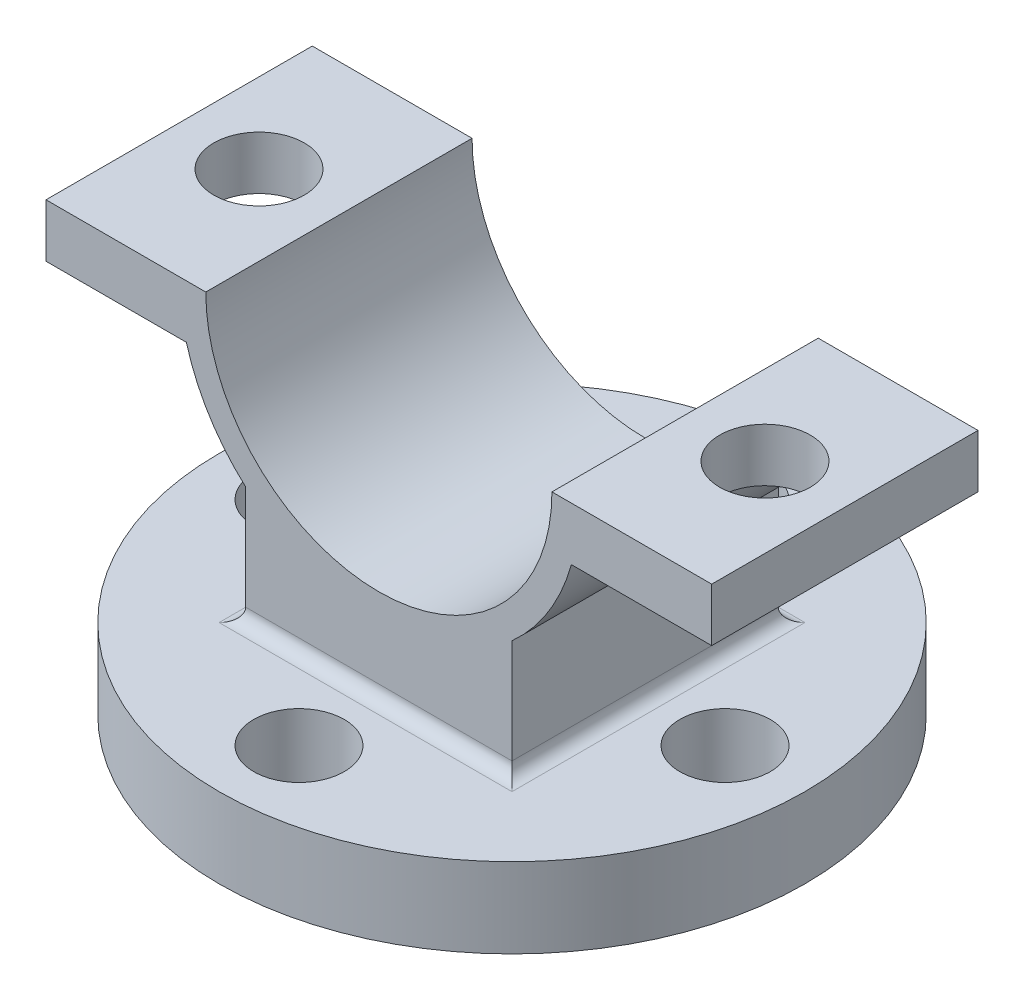
ISO-10303-21;
HEADER;
FILE_DESCRIPTION(('STEP AP214'),'2;1');
FILE_NAME('part.step','',(''),(''),'','','');
FILE_SCHEMA(('AUTOMOTIVE_DESIGN { 1 0 10303 214 1 1 1 1 }'));
ENDSEC;
DATA;
#1=APPLICATION_CONTEXT('core data for automotive mechanical design processes');
#2=APPLICATION_PROTOCOL_DEFINITION('international standard','automotive_design',2000,#1);
#3=PRODUCT_CONTEXT('',#1,'mechanical');
#4=PRODUCT('Part','Part','',(#3));
#5=PRODUCT_RELATED_PRODUCT_CATEGORY('part','',(#4));
#6=PRODUCT_DEFINITION_FORMATION('','',#4);
#7=PRODUCT_DEFINITION_CONTEXT('part definition',#1,'design');
#8=PRODUCT_DEFINITION('design','',#6,#7);
#9=PRODUCT_DEFINITION_SHAPE('','',#8);
#10=(LENGTH_UNIT() NAMED_UNIT(*) SI_UNIT(.MILLI.,.METRE.));
#11=(NAMED_UNIT(*) PLANE_ANGLE_UNIT() SI_UNIT($,.RADIAN.));
#12=(NAMED_UNIT(*) SI_UNIT($,.STERADIAN.) SOLID_ANGLE_UNIT());
#13=UNCERTAINTY_MEASURE_WITH_UNIT(LENGTH_MEASURE(1.E-05),#10,'distance_accuracy_value','');
#14=(GEOMETRIC_REPRESENTATION_CONTEXT(3) GLOBAL_UNCERTAINTY_ASSIGNED_CONTEXT((#13)) GLOBAL_UNIT_ASSIGNED_CONTEXT((#10,
#11,#12)) REPRESENTATION_CONTEXT('',''));
#15=CARTESIAN_POINT('',(0.,0.,0.));
#16=DIRECTION('',(0.,0.,1.));
#17=DIRECTION('',(1.,0.,0.));
#18=AXIS2_PLACEMENT_3D('',#15,#16,#17);
#19=CARTESIAN_POINT('',(-5.,0.,5.));
#20=DIRECTION('',(1.,0.,0.));
#21=DIRECTION('',(0.,1.,0.));
#22=AXIS2_PLACEMENT_3D('',#19,#20,#21);
#23=PLANE('',#22);
#24=DIRECTION('',(0.,-1.,0.));
#25=VECTOR('',#24,1.);
#26=CARTESIAN_POINT('',(-5.,0.,-5.));
#27=LINE('',#26,#25);
#28=CARTESIAN_POINT('',(-5.,4.40983005625053,-5.));
#29=VERTEX_POINT('',#28);
#30=CARTESIAN_POINT('',(-5.,0.5,-5.));
#31=VERTEX_POINT('',#30);
#32=EDGE_CURVE('E173',#29,#31,#27,.T.);
#33=ORIENTED_EDGE('',*,*,#32,.T.);
#34=DIRECTION('',(0.,0.,-1.));
#35=VECTOR('',#34,1.);
#36=CARTESIAN_POINT('',(-5.,0.5,5.));
#37=LINE('',#36,#35);
#38=CARTESIAN_POINT('',(-5.,0.5,5.));
#39=VERTEX_POINT('',#38);
#40=EDGE_CURVE('E228',#31,#39,#37,.F.);
#41=ORIENTED_EDGE('',*,*,#40,.T.);
#42=DIRECTION('',(0.,-1.,0.));
#43=VECTOR('',#42,1.);
#44=CARTESIAN_POINT('',(-5.,0.,5.));
#45=LINE('',#44,#43);
#46=CARTESIAN_POINT('',(-5.,4.40983005625053,5.));
#47=VERTEX_POINT('',#46);
#48=EDGE_CURVE('E139',#47,#39,#45,.T.);
#49=ORIENTED_EDGE('',*,*,#48,.F.);
#50=DIRECTION('',(0.,0.,-1.));
#51=VECTOR('',#50,1.);
#52=CARTESIAN_POINT('',(-5.,4.40983005625053,5.));
#53=LINE('',#52,#51);
#54=EDGE_CURVE('E172',#47,#29,#53,.T.);
#55=ORIENTED_EDGE('',*,*,#54,.T.);
#56=EDGE_LOOP('',(#33,#41,#49,#55));
#57=FACE_BOUND('',#56,.T.);
#58=ADVANCED_FACE('F35',(#57),#23,.F.);
#59=CARTESIAN_POINT('',(5.,0.,5.));
#60=DIRECTION('',(-1.,0.,0.));
#61=DIRECTION('',(0.,-1.,0.));
#62=AXIS2_PLACEMENT_3D('',#59,#60,#61);
#63=PLANE('',#62);
#64=DIRECTION('',(0.,1.,0.));
#65=VECTOR('',#64,1.);
#66=CARTESIAN_POINT('',(5.,0.,5.));
#67=LINE('',#66,#65);
#68=CARTESIAN_POINT('',(5.,0.5,5.));
#69=VERTEX_POINT('',#68);
#70=CARTESIAN_POINT('',(5.,4.40983005625053,5.));
#71=VERTEX_POINT('',#70);
#72=EDGE_CURVE('E133',#69,#71,#67,.T.);
#73=ORIENTED_EDGE('',*,*,#72,.F.);
#74=DIRECTION('',(0.,0.,-1.));
#75=VECTOR('',#74,1.);
#76=CARTESIAN_POINT('',(5.,0.5,-5.));
#77=LINE('',#76,#75);
#78=CARTESIAN_POINT('',(5.,0.5,-5.));
#79=VERTEX_POINT('',#78);
#80=EDGE_CURVE('E44',#69,#79,#77,.T.);
#81=ORIENTED_EDGE('',*,*,#80,.T.);
#82=DIRECTION('',(0.,1.,0.));
#83=VECTOR('',#82,1.);
#84=CARTESIAN_POINT('',(5.,0.,-5.));
#85=LINE('',#84,#83);
#86=CARTESIAN_POINT('',(5.,4.40983005625053,-5.));
#87=VERTEX_POINT('',#86);
#88=EDGE_CURVE('E144',#79,#87,#85,.T.);
#89=ORIENTED_EDGE('',*,*,#88,.T.);
#90=DIRECTION('',(0.,0.,-1.));
#91=VECTOR('',#90,1.);
#92=CARTESIAN_POINT('',(5.,4.40983005625053,5.));
#93=LINE('',#92,#91);
#94=EDGE_CURVE('E142',#71,#87,#93,.T.);
#95=ORIENTED_EDGE('',*,*,#94,.F.);
#96=EDGE_LOOP('',(#73,#81,#89,#95));
#97=FACE_BOUND('',#96,.T.);
#98=ADVANCED_FACE('F143',(#97),#63,.F.);
#99=CARTESIAN_POINT('',(0.,10.,5.));
#100=DIRECTION('',(0.,0.,-1.));
#101=DIRECTION('',(-1.,0.,0.));
#102=AXIS2_PLACEMENT_3D('',#99,#100,#101);
#103=CYLINDRICAL_SURFACE('',#102,7.5);
#104=CARTESIAN_POINT('',(0.,10.,-5.));
#105=DIRECTION('',(0.,0.,1.));
#106=DIRECTION('',(1.,0.,0.));
#107=AXIS2_PLACEMENT_3D('',#104,#105,#106);
#108=CIRCLE('',#107,7.5);
#109=CARTESIAN_POINT('',(7.22841614740048,8.,-5.));
#110=VERTEX_POINT('',#109);
#111=EDGE_CURVE('E178',#87,#110,#108,.T.);
#112=ORIENTED_EDGE('',*,*,#111,.T.);
#113=DIRECTION('',(0.,0.,-1.));
#114=VECTOR('',#113,1.);
#115=CARTESIAN_POINT('',(7.22841614740048,8.,5.));
#116=LINE('',#115,#114);
#117=CARTESIAN_POINT('',(7.22841614740048,8.,5.));
#118=VERTEX_POINT('',#117);
#119=EDGE_CURVE('E148',#118,#110,#116,.T.);
#120=ORIENTED_EDGE('',*,*,#119,.F.);
#121=CARTESIAN_POINT('',(0.,10.,5.));
#122=DIRECTION('',(0.,0.,1.));
#123=DIRECTION('',(1.,0.,0.));
#124=AXIS2_PLACEMENT_3D('',#121,#122,#123);
#125=CIRCLE('',#124,7.5);
#126=EDGE_CURVE('E137',#71,#118,#125,.T.);
#127=ORIENTED_EDGE('',*,*,#126,.F.);
#128=ORIENTED_EDGE('',*,*,#94,.T.);
#129=EDGE_LOOP('',(#112,#120,#127,#128));
#130=FACE_BOUND('',#129,.T.);
#131=ADVANCED_FACE('F150',(#130),#103,.T.);
#132=CARTESIAN_POINT('',(12.5,8.,5.));
#133=DIRECTION('',(0.,1.,0.));
#134=DIRECTION('',(0.,0.,1.));
#135=AXIS2_PLACEMENT_3D('',#132,#133,#134);
#136=PLANE('',#135);
#137=CARTESIAN_POINT('',(9.49999999999999,8.,0.));
#138=DIRECTION('',(0.,1.,0.));
#139=DIRECTION('',(0.,0.,1.));
#140=AXIS2_PLACEMENT_3D('',#137,#138,#139);
#141=CIRCLE('',#140,1.7);
#142=CARTESIAN_POINT('',(9.49999999999999,8.,1.7));
#143=VERTEX_POINT('',#142);
#144=EDGE_CURVE('E527',#143,#143,#141,.F.);
#145=ORIENTED_EDGE('',*,*,#144,.F.);
#146=EDGE_LOOP('',(#145));
#147=FACE_BOUND('',#146,.T.);
#148=DIRECTION('',(1.,0.,0.));
#149=VECTOR('',#148,1.);
#150=CARTESIAN_POINT('',(12.5,8.,-5.));
#151=LINE('',#150,#149);
#152=CARTESIAN_POINT('',(12.5,8.,-5.));
#153=VERTEX_POINT('',#152);
#154=EDGE_CURVE('E180',#110,#153,#151,.T.);
#155=ORIENTED_EDGE('',*,*,#154,.T.);
#156=DIRECTION('',(0.,0.,-1.));
#157=VECTOR('',#156,1.);
#158=CARTESIAN_POINT('',(12.5,8.,5.));
#159=LINE('',#158,#157);
#160=CARTESIAN_POINT('',(12.5,8.,5.));
#161=VERTEX_POINT('',#160);
#162=EDGE_CURVE('E216',#161,#153,#159,.T.);
#163=ORIENTED_EDGE('',*,*,#162,.F.);
#164=DIRECTION('',(1.,0.,0.));
#165=VECTOR('',#164,1.);
#166=CARTESIAN_POINT('',(12.5,8.,5.));
#167=LINE('',#166,#165);
#168=EDGE_CURVE('E153',#118,#161,#167,.T.);
#169=ORIENTED_EDGE('',*,*,#168,.F.);
#170=ORIENTED_EDGE('',*,*,#119,.T.);
#171=EDGE_LOOP('',(#155,#163,#169,#170));
#172=FACE_BOUND('',#171,.T.);
#173=ADVANCED_FACE('F371',(#147,#172),#136,.F.);
#174=CARTESIAN_POINT('',(12.5,10.,5.));
#175=DIRECTION('',(-1.,0.,0.));
#176=DIRECTION('',(0.,0.,1.));
#177=AXIS2_PLACEMENT_3D('',#174,#175,#176);
#178=PLANE('',#177);
#179=DIRECTION('',(0.,1.,0.));
#180=VECTOR('',#179,1.);
#181=CARTESIAN_POINT('',(12.5,10.,-5.));
#182=LINE('',#181,#180);
#183=CARTESIAN_POINT('',(12.5,10.,-5.));
#184=VERTEX_POINT('',#183);
#185=EDGE_CURVE('E182',#153,#184,#182,.T.);
#186=ORIENTED_EDGE('',*,*,#185,.T.);
#187=DIRECTION('',(0.,0.,-1.));
#188=VECTOR('',#187,1.);
#189=CARTESIAN_POINT('',(12.5,10.,5.));
#190=LINE('',#189,#188);
#191=CARTESIAN_POINT('',(12.5,10.,5.));
#192=VERTEX_POINT('',#191);
#193=EDGE_CURVE('E213',#192,#184,#190,.T.);
#194=ORIENTED_EDGE('',*,*,#193,.F.);
#195=DIRECTION('',(0.,1.,0.));
#196=VECTOR('',#195,1.);
#197=CARTESIAN_POINT('',(12.5,10.,5.));
#198=LINE('',#197,#196);
#199=EDGE_CURVE('E155',#161,#192,#198,.T.);
#200=ORIENTED_EDGE('',*,*,#199,.F.);
#201=ORIENTED_EDGE('',*,*,#162,.T.);
#202=EDGE_LOOP('',(#186,#194,#200,#201));
#203=FACE_BOUND('',#202,.T.);
#204=ADVANCED_FACE('F367',(#203),#178,.F.);
#205=CARTESIAN_POINT('',(6.5,10.,5.));
#206=DIRECTION('',(0.,-1.,0.));
#207=DIRECTION('',(1.,0.,0.));
#208=AXIS2_PLACEMENT_3D('',#205,#206,#207);
#209=PLANE('',#208);
#210=CARTESIAN_POINT('',(9.49999999999999,10.,0.));
#211=DIRECTION('',(0.,1.,0.));
#212=DIRECTION('',(1.,0.,0.));
#213=AXIS2_PLACEMENT_3D('',#210,#211,#212);
#214=CIRCLE('',#213,1.7);
#215=CARTESIAN_POINT('',(11.2,10.,0.));
#216=VERTEX_POINT('',#215);
#217=EDGE_CURVE('E554',#216,#216,#214,.T.);
#218=ORIENTED_EDGE('',*,*,#217,.F.);
#219=EDGE_LOOP('',(#218));
#220=FACE_BOUND('',#219,.T.);
#221=DIRECTION('',(-1.,0.,0.));
#222=VECTOR('',#221,1.);
#223=CARTESIAN_POINT('',(6.5,10.,-5.));
#224=LINE('',#223,#222);
#225=CARTESIAN_POINT('',(6.5,10.,-5.));
#226=VERTEX_POINT('',#225);
#227=EDGE_CURVE('E184',#184,#226,#224,.T.);
#228=ORIENTED_EDGE('',*,*,#227,.T.);
#229=DIRECTION('',(0.,0.,-1.));
#230=VECTOR('',#229,1.);
#231=CARTESIAN_POINT('',(6.5,10.,5.));
#232=LINE('',#231,#230);
#233=CARTESIAN_POINT('',(6.5,10.,5.));
#234=VERTEX_POINT('',#233);
#235=EDGE_CURVE('E210',#234,#226,#232,.T.);
#236=ORIENTED_EDGE('',*,*,#235,.F.);
#237=DIRECTION('',(-1.,0.,0.));
#238=VECTOR('',#237,1.);
#239=CARTESIAN_POINT('',(6.5,10.,5.));
#240=LINE('',#239,#238);
#241=EDGE_CURVE('E160',#192,#234,#240,.T.);
#242=ORIENTED_EDGE('',*,*,#241,.F.);
#243=ORIENTED_EDGE('',*,*,#193,.T.);
#244=EDGE_LOOP('',(#228,#236,#242,#243));
#245=FACE_BOUND('',#244,.T.);
#246=ADVANCED_FACE('F363',(#220,#245),#209,.F.);
#247=CARTESIAN_POINT('',(0.,10.,5.));
#248=DIRECTION('',(0.,0.,-1.));
#249=DIRECTION('',(-1.,0.,0.));
#250=AXIS2_PLACEMENT_3D('',#247,#248,#249);
#251=CYLINDRICAL_SURFACE('',#250,6.5);
#252=CARTESIAN_POINT('',(0.,10.,-5.));
#253=DIRECTION('',(0.,0.,-1.));
#254=DIRECTION('',(1.,0.,0.));
#255=AXIS2_PLACEMENT_3D('',#252,#253,#254);
#256=CIRCLE('',#255,6.5);
#257=CARTESIAN_POINT('',(-6.5,10.,-5.));
#258=VERTEX_POINT('',#257);
#259=EDGE_CURVE('E186',#226,#258,#256,.T.);
#260=ORIENTED_EDGE('',*,*,#259,.T.);
#261=DIRECTION('',(0.,0.,-1.));
#262=VECTOR('',#261,1.);
#263=CARTESIAN_POINT('',(-6.5,10.,5.));
#264=LINE('',#263,#262);
#265=CARTESIAN_POINT('',(-6.5,10.,5.));
#266=VERTEX_POINT('',#265);
#267=EDGE_CURVE('E207',#266,#258,#264,.T.);
#268=ORIENTED_EDGE('',*,*,#267,.F.);
#269=CARTESIAN_POINT('',(0.,10.,5.));
#270=DIRECTION('',(0.,0.,-1.));
#271=DIRECTION('',(1.,0.,0.));
#272=AXIS2_PLACEMENT_3D('',#269,#270,#271);
#273=CIRCLE('',#272,6.5);
#274=EDGE_CURVE('E162',#234,#266,#273,.T.);
#275=ORIENTED_EDGE('',*,*,#274,.F.);
#276=ORIENTED_EDGE('',*,*,#235,.T.);
#277=EDGE_LOOP('',(#260,#268,#275,#276));
#278=FACE_BOUND('',#277,.T.);
#279=ADVANCED_FACE('F359',(#278),#251,.F.);
#280=CARTESIAN_POINT('',(-6.5,10.,5.));
#281=DIRECTION('',(0.,-1.,0.));
#282=DIRECTION('',(1.,0.,0.));
#283=AXIS2_PLACEMENT_3D('',#280,#281,#282);
#284=PLANE('',#283);
#285=CARTESIAN_POINT('',(-9.5,10.,0.));
#286=DIRECTION('',(0.,1.,0.));
#287=DIRECTION('',(-1.,0.,0.));
#288=AXIS2_PLACEMENT_3D('',#285,#286,#287);
#289=CIRCLE('',#288,1.7);
#290=CARTESIAN_POINT('',(-11.2,10.,0.));
#291=VERTEX_POINT('',#290);
#292=EDGE_CURVE('E553',#291,#291,#289,.T.);
#293=ORIENTED_EDGE('',*,*,#292,.F.);
#294=EDGE_LOOP('',(#293));
#295=FACE_BOUND('',#294,.T.);
#296=DIRECTION('',(-1.,0.,0.));
#297=VECTOR('',#296,1.);
#298=CARTESIAN_POINT('',(-6.5,10.,-5.));
#299=LINE('',#298,#297);
#300=CARTESIAN_POINT('',(-12.5,10.,-5.));
#301=VERTEX_POINT('',#300);
#302=EDGE_CURVE('E188',#258,#301,#299,.T.);
#303=ORIENTED_EDGE('',*,*,#302,.T.);
#304=DIRECTION('',(0.,0.,-1.));
#305=VECTOR('',#304,1.);
#306=CARTESIAN_POINT('',(-12.5,10.,5.));
#307=LINE('',#306,#305);
#308=CARTESIAN_POINT('',(-12.5,10.,5.));
#309=VERTEX_POINT('',#308);
#310=EDGE_CURVE('E204',#309,#301,#307,.T.);
#311=ORIENTED_EDGE('',*,*,#310,.F.);
#312=DIRECTION('',(-1.,0.,0.));
#313=VECTOR('',#312,1.);
#314=CARTESIAN_POINT('',(-6.5,10.,5.));
#315=LINE('',#314,#313);
#316=EDGE_CURVE('E164',#266,#309,#315,.T.);
#317=ORIENTED_EDGE('',*,*,#316,.F.);
#318=ORIENTED_EDGE('',*,*,#267,.T.);
#319=EDGE_LOOP('',(#303,#311,#317,#318));
#320=FACE_BOUND('',#319,.T.);
#321=ADVANCED_FACE('F355',(#295,#320),#284,.F.);
#322=CARTESIAN_POINT('',(-12.5,10.,5.));
#323=DIRECTION('',(1.,0.,0.));
#324=DIRECTION('',(0.,0.,-1.));
#325=AXIS2_PLACEMENT_3D('',#322,#323,#324);
#326=PLANE('',#325);
#327=DIRECTION('',(0.,-1.,0.));
#328=VECTOR('',#327,1.);
#329=CARTESIAN_POINT('',(-12.5,10.,-5.));
#330=LINE('',#329,#328);
#331=CARTESIAN_POINT('',(-12.5,8.,-5.));
#332=VERTEX_POINT('',#331);
#333=EDGE_CURVE('E190',#301,#332,#330,.T.);
#334=ORIENTED_EDGE('',*,*,#333,.T.);
#335=DIRECTION('',(0.,0.,-1.));
#336=VECTOR('',#335,1.);
#337=CARTESIAN_POINT('',(-12.5,8.,5.));
#338=LINE('',#337,#336);
#339=CARTESIAN_POINT('',(-12.5,8.,5.));
#340=VERTEX_POINT('',#339);
#341=EDGE_CURVE('E201',#340,#332,#338,.T.);
#342=ORIENTED_EDGE('',*,*,#341,.F.);
#343=DIRECTION('',(0.,-1.,0.));
#344=VECTOR('',#343,1.);
#345=CARTESIAN_POINT('',(-12.5,10.,5.));
#346=LINE('',#345,#344);
#347=EDGE_CURVE('E166',#309,#340,#346,.T.);
#348=ORIENTED_EDGE('',*,*,#347,.F.);
#349=ORIENTED_EDGE('',*,*,#310,.T.);
#350=EDGE_LOOP('',(#334,#342,#348,#349));
#351=FACE_BOUND('',#350,.T.);
#352=ADVANCED_FACE('F351',(#351),#326,.F.);
#353=CARTESIAN_POINT('',(-12.5,8.,5.));
#354=DIRECTION('',(0.,1.,0.));
#355=DIRECTION('',(0.,0.,1.));
#356=AXIS2_PLACEMENT_3D('',#353,#354,#355);
#357=PLANE('',#356);
#358=CARTESIAN_POINT('',(-9.5,8.,0.));
#359=DIRECTION('',(0.,1.,0.));
#360=DIRECTION('',(0.,0.,1.));
#361=AXIS2_PLACEMENT_3D('',#358,#359,#360);
#362=CIRCLE('',#361,1.7);
#363=CARTESIAN_POINT('',(-9.5,8.,1.7));
#364=VERTEX_POINT('',#363);
#365=EDGE_CURVE('E237',#364,#364,#362,.F.);
#366=ORIENTED_EDGE('',*,*,#365,.F.);
#367=EDGE_LOOP('',(#366));
#368=FACE_BOUND('',#367,.T.);
#369=DIRECTION('',(1.,0.,0.));
#370=VECTOR('',#369,1.);
#371=CARTESIAN_POINT('',(-12.5,8.,-5.));
#372=LINE('',#371,#370);
#373=CARTESIAN_POINT('',(-7.22841614740048,8.,-5.));
#374=VERTEX_POINT('',#373);
#375=EDGE_CURVE('E192',#332,#374,#372,.T.);
#376=ORIENTED_EDGE('',*,*,#375,.T.);
#377=DIRECTION('',(0.,0.,-1.));
#378=VECTOR('',#377,1.);
#379=CARTESIAN_POINT('',(-7.22841614740048,8.,5.));
#380=LINE('',#379,#378);
#381=CARTESIAN_POINT('',(-7.22841614740048,8.,5.));
#382=VERTEX_POINT('',#381);
#383=EDGE_CURVE('E198',#382,#374,#380,.T.);
#384=ORIENTED_EDGE('',*,*,#383,.F.);
#385=DIRECTION('',(1.,0.,0.));
#386=VECTOR('',#385,1.);
#387=CARTESIAN_POINT('',(-12.5,8.,5.));
#388=LINE('',#387,#386);
#389=EDGE_CURVE('E168',#340,#382,#388,.T.);
#390=ORIENTED_EDGE('',*,*,#389,.F.);
#391=ORIENTED_EDGE('',*,*,#341,.T.);
#392=EDGE_LOOP('',(#376,#384,#390,#391));
#393=FACE_BOUND('',#392,.T.);
#394=ADVANCED_FACE('F347',(#368,#393),#357,.F.);
#395=CARTESIAN_POINT('',(0.,10.,5.));
#396=DIRECTION('',(0.,0.,-1.));
#397=DIRECTION('',(-1.,0.,0.));
#398=AXIS2_PLACEMENT_3D('',#395,#396,#397);
#399=CYLINDRICAL_SURFACE('',#398,7.5);
#400=CARTESIAN_POINT('',(0.,10.,-5.));
#401=DIRECTION('',(0.,0.,1.));
#402=DIRECTION('',(1.,0.,0.));
#403=AXIS2_PLACEMENT_3D('',#400,#401,#402);
#404=CIRCLE('',#403,7.5);
#405=EDGE_CURVE('E194',#374,#29,#404,.T.);
#406=ORIENTED_EDGE('',*,*,#405,.T.);
#407=ORIENTED_EDGE('',*,*,#54,.F.);
#408=CARTESIAN_POINT('',(0.,10.,5.));
#409=DIRECTION('',(0.,0.,1.));
#410=DIRECTION('',(1.,0.,0.));
#411=AXIS2_PLACEMENT_3D('',#408,#409,#410);
#412=CIRCLE('',#411,7.5);
#413=EDGE_CURVE('E170',#382,#47,#412,.T.);
#414=ORIENTED_EDGE('',*,*,#413,.F.);
#415=ORIENTED_EDGE('',*,*,#383,.T.);
#416=EDGE_LOOP('',(#406,#407,#414,#415));
#417=FACE_BOUND('',#416,.T.);
#418=ADVANCED_FACE('F341',(#417),#399,.T.);
#419=CARTESIAN_POINT('',(0.,10.,5.));
#420=DIRECTION('',(0.,0.,1.));
#421=DIRECTION('',(1.,0.,0.));
#422=AXIS2_PLACEMENT_3D('',#419,#420,#421);
#423=PLANE('',#422);
#424=ORIENTED_EDGE('',*,*,#48,.T.);
#425=DIRECTION('',(1.,0.,0.));
#426=VECTOR('',#425,1.);
#427=CARTESIAN_POINT('',(0.,0.5,5.));
#428=LINE('',#427,#426);
#429=EDGE_CURVE('E11',#39,#69,#428,.T.);
#430=ORIENTED_EDGE('',*,*,#429,.T.);
#431=ORIENTED_EDGE('',*,*,#72,.T.);
#432=ORIENTED_EDGE('',*,*,#126,.T.);
#433=ORIENTED_EDGE('',*,*,#168,.T.);
#434=ORIENTED_EDGE('',*,*,#199,.T.);
#435=ORIENTED_EDGE('',*,*,#241,.T.);
#436=ORIENTED_EDGE('',*,*,#274,.T.);
#437=ORIENTED_EDGE('',*,*,#316,.T.);
#438=ORIENTED_EDGE('',*,*,#347,.T.);
#439=ORIENTED_EDGE('',*,*,#389,.T.);
#440=ORIENTED_EDGE('',*,*,#413,.T.);
#441=EDGE_LOOP('',(#424,#430,#431,#432,#433,#434,#435,#436,#437,#438,#439,#440));
#442=FACE_BOUND('',#441,.T.);
#443=ADVANCED_FACE('F135',(#442),#423,.T.);
#444=CARTESIAN_POINT('',(0.,10.,-5.));
#445=DIRECTION('',(0.,0.,1.));
#446=DIRECTION('',(1.,0.,0.));
#447=AXIS2_PLACEMENT_3D('',#444,#445,#446);
#448=PLANE('',#447);
#449=ORIENTED_EDGE('',*,*,#88,.F.);
#450=DIRECTION('',(1.,0.,0.));
#451=VECTOR('',#450,1.);
#452=CARTESIAN_POINT('',(-5.,0.5,-5.));
#453=LINE('',#452,#451);
#454=EDGE_CURVE('E231',#79,#31,#453,.F.);
#455=ORIENTED_EDGE('',*,*,#454,.T.);
#456=ORIENTED_EDGE('',*,*,#32,.F.);
#457=ORIENTED_EDGE('',*,*,#405,.F.);
#458=ORIENTED_EDGE('',*,*,#375,.F.);
#459=ORIENTED_EDGE('',*,*,#333,.F.);
#460=ORIENTED_EDGE('',*,*,#302,.F.);
#461=ORIENTED_EDGE('',*,*,#259,.F.);
#462=ORIENTED_EDGE('',*,*,#227,.F.);
#463=ORIENTED_EDGE('',*,*,#185,.F.);
#464=ORIENTED_EDGE('',*,*,#154,.F.);
#465=ORIENTED_EDGE('',*,*,#111,.F.);
#466=EDGE_LOOP('',(#449,#455,#456,#457,#458,#459,#460,#461,#462,#463,#464,#465));
#467=FACE_BOUND('',#466,.T.);
#468=ADVANCED_FACE('F335',(#467),#448,.F.);
#469=CARTESIAN_POINT('',(0.,0.,0.));
#470=DIRECTION('',(0.,-1.,0.));
#471=DIRECTION('',(0.,0.,-1.));
#472=AXIS2_PLACEMENT_3D('',#469,#470,#471);
#473=PLANE('',#472);
#474=DIRECTION('',(1.,0.,0.));
#475=VECTOR('',#474,1.);
#476=CARTESIAN_POINT('',(0.,0.,5.5));
#477=LINE('',#476,#475);
#478=CARTESIAN_POINT('',(5.5,0.,5.5));
#479=VERTEX_POINT('',#478);
#480=CARTESIAN_POINT('',(-5.5,0.,5.5));
#481=VERTEX_POINT('',#480);
#482=EDGE_CURVE('E147',#479,#481,#477,.F.);
#483=ORIENTED_EDGE('',*,*,#482,.T.);
#484=DIRECTION('',(0.,0.,-1.));
#485=VECTOR('',#484,1.);
#486=CARTESIAN_POINT('',(-5.5,0.,-5.));
#487=LINE('',#486,#485);
#488=CARTESIAN_POINT('',(-5.5,0.,-5.5));
#489=VERTEX_POINT('',#488);
#490=EDGE_CURVE('E225',#481,#489,#487,.T.);
#491=ORIENTED_EDGE('',*,*,#490,.T.);
#492=DIRECTION('',(1.,0.,0.));
#493=VECTOR('',#492,1.);
#494=CARTESIAN_POINT('',(5.,0.,-5.5));
#495=LINE('',#494,#493);
#496=CARTESIAN_POINT('',(5.5,0.,-5.5));
#497=VERTEX_POINT('',#496);
#498=EDGE_CURVE('E223',#489,#497,#495,.T.);
#499=ORIENTED_EDGE('',*,*,#498,.T.);
#500=DIRECTION('',(0.,0.,-1.));
#501=VECTOR('',#500,1.);
#502=CARTESIAN_POINT('',(5.5,0.,5.));
#503=LINE('',#502,#501);
#504=EDGE_CURVE('E221',#497,#479,#503,.F.);
#505=ORIENTED_EDGE('',*,*,#504,.T.);
#506=EDGE_LOOP('',(#483,#491,#499,#505));
#507=FACE_BOUND('',#506,.T.);
#508=CARTESIAN_POINT('',(0.,0.,8.));
#509=DIRECTION('',(0.,-1.,0.));
#510=DIRECTION('',(0.,0.,-1.));
#511=AXIS2_PLACEMENT_3D('',#508,#509,#510);
#512=CIRCLE('',#511,1.7);
#513=CARTESIAN_POINT('',(0.,0.,6.3));
#514=VERTEX_POINT('',#513);
#515=EDGE_CURVE('E263',#514,#514,#512,.T.);
#516=ORIENTED_EDGE('',*,*,#515,.T.);
#517=EDGE_LOOP('',(#516));
#518=FACE_BOUND('',#517,.T.);
#519=CARTESIAN_POINT('',(8.00000000000023,0.,2.25904099284255E-13));
#520=DIRECTION('',(0.,-1.,0.));
#521=DIRECTION('',(0.,0.,-1.));
#522=AXIS2_PLACEMENT_3D('',#519,#520,#521);
#523=CIRCLE('',#522,1.70000000000018);
#524=CARTESIAN_POINT('',(8.00000000000023,0.,-1.69999999999995));
#525=VERTEX_POINT('',#524);
#526=EDGE_CURVE('E566',#525,#525,#523,.T.);
#527=ORIENTED_EDGE('',*,*,#526,.T.);
#528=EDGE_LOOP('',(#527));
#529=FACE_BOUND('',#528,.T.);
#530=CARTESIAN_POINT('',(4.51808198568511E-13,0.,-8.));
#531=DIRECTION('',(0.,-1.,0.));
#532=DIRECTION('',(0.,0.,-1.));
#533=AXIS2_PLACEMENT_3D('',#530,#531,#532);
#534=CIRCLE('',#533,1.70000000000049);
#535=CARTESIAN_POINT('',(4.51808198568511E-13,0.,-9.70000000000049));
#536=VERTEX_POINT('',#535);
#537=EDGE_CURVE('E572',#536,#536,#534,.T.);
#538=ORIENTED_EDGE('',*,*,#537,.T.);
#539=EDGE_LOOP('',(#538));
#540=FACE_BOUND('',#539,.T.);
#541=CARTESIAN_POINT('',(-7.99999999999977,0.,-2.26883816723573E-13));
#542=DIRECTION('',(0.,-1.,0.));
#543=DIRECTION('',(0.,0.,-1.));
#544=AXIS2_PLACEMENT_3D('',#541,#542,#543);
#545=CIRCLE('',#544,1.70000000000036);
#546=CARTESIAN_POINT('',(-7.99999999999977,0.,-1.70000000000059));
#547=VERTEX_POINT('',#546);
#548=EDGE_CURVE('E250',#547,#547,#545,.T.);
#549=ORIENTED_EDGE('',*,*,#548,.T.);
#550=EDGE_LOOP('',(#549));
#551=FACE_BOUND('',#550,.T.);
#552=CARTESIAN_POINT('',(0.,0.,0.));
#553=DIRECTION('',(0.,-1.,0.));
#554=DIRECTION('',(0.,0.,-1.));
#555=AXIS2_PLACEMENT_3D('',#552,#553,#554);
#556=CIRCLE('',#555,11.);
#557=CARTESIAN_POINT('',(0.,0.,-11.));
#558=VERTEX_POINT('',#557);
#559=EDGE_CURVE('E261',#558,#558,#556,.T.);
#560=ORIENTED_EDGE('',*,*,#559,.F.);
#561=EDGE_LOOP('',(#560));
#562=FACE_BOUND('',#561,.T.);
#563=ADVANCED_FACE('F278',(#507,#518,#529,#540,#551,#562),#473,.F.);
#564=CARTESIAN_POINT('',(0.,-3.,0.));
#565=DIRECTION('',(0.,1.,0.));
#566=DIRECTION('',(0.,0.,1.));
#567=AXIS2_PLACEMENT_3D('',#564,#565,#566);
#568=CYLINDRICAL_SURFACE('',#567,11.);
#569=CARTESIAN_POINT('',(0.,-3.,0.));
#570=DIRECTION('',(0.,-1.,0.));
#571=DIRECTION('',(0.,0.,-1.));
#572=AXIS2_PLACEMENT_3D('',#569,#570,#571);
#573=CIRCLE('',#572,11.);
#574=CARTESIAN_POINT('',(0.,-3.,-11.));
#575=VERTEX_POINT('',#574);
#576=EDGE_CURVE('E176',#575,#575,#573,.T.);
#577=ORIENTED_EDGE('',*,*,#576,.F.);
#578=EDGE_LOOP('',(#577));
#579=FACE_BOUND('',#578,.T.);
#580=ORIENTED_EDGE('',*,*,#559,.T.);
#581=EDGE_LOOP('',(#580));
#582=FACE_BOUND('',#581,.T.);
#583=ADVANCED_FACE('F331',(#579,#582),#568,.T.);
#584=CARTESIAN_POINT('',(0.,-3.,0.));
#585=DIRECTION('',(0.,-1.,0.));
#586=DIRECTION('',(0.,0.,-1.));
#587=AXIS2_PLACEMENT_3D('',#584,#585,#586);
#588=PLANE('',#587);
#589=CARTESIAN_POINT('',(0.,-3.,8.));
#590=DIRECTION('',(0.,-1.,0.));
#591=DIRECTION('',(0.,0.,-1.));
#592=AXIS2_PLACEMENT_3D('',#589,#590,#591);
#593=CIRCLE('',#592,1.7);
#594=CARTESIAN_POINT('',(0.,-3.,6.3));
#595=VERTEX_POINT('',#594);
#596=EDGE_CURVE('E563',#595,#595,#593,.T.);
#597=ORIENTED_EDGE('',*,*,#596,.F.);
#598=EDGE_LOOP('',(#597));
#599=FACE_BOUND('',#598,.T.);
#600=CARTESIAN_POINT('',(8.00000000000023,-3.,2.25904099284255E-13));
#601=DIRECTION('',(0.,-1.,0.));
#602=DIRECTION('',(0.,0.,-1.));
#603=AXIS2_PLACEMENT_3D('',#600,#601,#602);
#604=CIRCLE('',#603,1.70000000000018);
#605=CARTESIAN_POINT('',(8.00000000000023,-3.,-1.69999999999995));
#606=VERTEX_POINT('',#605);
#607=EDGE_CURVE('E569',#606,#606,#604,.T.);
#608=ORIENTED_EDGE('',*,*,#607,.F.);
#609=EDGE_LOOP('',(#608));
#610=FACE_BOUND('',#609,.T.);
#611=CARTESIAN_POINT('',(4.51808198568511E-13,-3.,-8.));
#612=DIRECTION('',(0.,-1.,0.));
#613=DIRECTION('',(0.,0.,-1.));
#614=AXIS2_PLACEMENT_3D('',#611,#612,#613);
#615=CIRCLE('',#614,1.70000000000049);
#616=CARTESIAN_POINT('',(4.51808198568511E-13,-3.,-9.70000000000049));
#617=VERTEX_POINT('',#616);
#618=EDGE_CURVE('E255',#617,#617,#615,.T.);
#619=ORIENTED_EDGE('',*,*,#618,.F.);
#620=EDGE_LOOP('',(#619));
#621=FACE_BOUND('',#620,.T.);
#622=CARTESIAN_POINT('',(-7.99999999999977,-3.,-2.26883816723573E-13));
#623=DIRECTION('',(0.,-1.,0.));
#624=DIRECTION('',(0.,0.,-1.));
#625=AXIS2_PLACEMENT_3D('',#622,#623,#624);
#626=CIRCLE('',#625,1.70000000000036);
#627=CARTESIAN_POINT('',(-7.99999999999977,-3.,-1.70000000000059));
#628=VERTEX_POINT('',#627);
#629=EDGE_CURVE('E245',#628,#628,#626,.T.);
#630=ORIENTED_EDGE('',*,*,#629,.F.);
#631=EDGE_LOOP('',(#630));
#632=FACE_BOUND('',#631,.T.);
#633=ORIENTED_EDGE('',*,*,#576,.T.);
#634=EDGE_LOOP('',(#633));
#635=FACE_BOUND('',#634,.T.);
#636=ADVANCED_FACE('F327',(#599,#610,#621,#632,#635),#588,.T.);
#637=CARTESIAN_POINT('',(-7.99999999999977,0.,-2.26883816723573E-13));
#638=DIRECTION('',(0.,-1.,0.));
#639=DIRECTION('',(0.,0.,-1.));
#640=AXIS2_PLACEMENT_3D('',#637,#638,#639);
#641=CYLINDRICAL_SURFACE('',#640,1.70000000000036);
#642=ORIENTED_EDGE('',*,*,#548,.F.);
#643=EDGE_LOOP('',(#642));
#644=FACE_BOUND('',#643,.T.);
#645=ORIENTED_EDGE('',*,*,#629,.T.);
#646=EDGE_LOOP('',(#645));
#647=FACE_BOUND('',#646,.T.);
#648=ADVANCED_FACE('F323',(#644,#647),#641,.F.);
#649=CARTESIAN_POINT('',(4.51808198568511E-13,0.,-8.));
#650=DIRECTION('',(0.,-1.,0.));
#651=DIRECTION('',(0.,0.,-1.));
#652=AXIS2_PLACEMENT_3D('',#649,#650,#651);
#653=CYLINDRICAL_SURFACE('',#652,1.70000000000049);
#654=ORIENTED_EDGE('',*,*,#537,.F.);
#655=EDGE_LOOP('',(#654));
#656=FACE_BOUND('',#655,.T.);
#657=ORIENTED_EDGE('',*,*,#618,.T.);
#658=EDGE_LOOP('',(#657));
#659=FACE_BOUND('',#658,.T.);
#660=ADVANCED_FACE('F319',(#656,#659),#653,.F.);
#661=CARTESIAN_POINT('',(8.00000000000023,0.,2.25904099284255E-13));
#662=DIRECTION('',(0.,-1.,0.));
#663=DIRECTION('',(0.,0.,-1.));
#664=AXIS2_PLACEMENT_3D('',#661,#662,#663);
#665=CYLINDRICAL_SURFACE('',#664,1.70000000000018);
#666=ORIENTED_EDGE('',*,*,#526,.F.);
#667=EDGE_LOOP('',(#666));
#668=FACE_BOUND('',#667,.T.);
#669=ORIENTED_EDGE('',*,*,#607,.T.);
#670=EDGE_LOOP('',(#669));
#671=FACE_BOUND('',#670,.T.);
#672=ADVANCED_FACE('F315',(#668,#671),#665,.F.);
#673=CARTESIAN_POINT('',(0.,0.,8.));
#674=DIRECTION('',(0.,-1.,0.));
#675=DIRECTION('',(0.,0.,-1.));
#676=AXIS2_PLACEMENT_3D('',#673,#674,#675);
#677=CYLINDRICAL_SURFACE('',#676,1.7);
#678=ORIENTED_EDGE('',*,*,#515,.F.);
#679=EDGE_LOOP('',(#678));
#680=FACE_BOUND('',#679,.T.);
#681=ORIENTED_EDGE('',*,*,#596,.T.);
#682=EDGE_LOOP('',(#681));
#683=FACE_BOUND('',#682,.T.);
#684=ADVANCED_FACE('F287',(#680,#683),#677,.F.);
#685=CARTESIAN_POINT('',(5.5,0.5,5.));
#686=DIRECTION('',(0.,0.,1.));
#687=DIRECTION('',(1.,0.,0.));
#688=AXIS2_PLACEMENT_3D('',#685,#686,#687);
#689=CYLINDRICAL_SURFACE('',#688,0.5);
#690=CARTESIAN_POINT('',(5.5,0.5,-5.5));
#691=DIRECTION('',(0.707106781186547,0.,0.707106781186547));
#692=DIRECTION('',(-0.707106781186547,0.,0.707106781186547));
#693=AXIS2_PLACEMENT_3D('',#690,#691,#692);
#694=ELLIPSE('',#693,0.707106781186547,0.5);
#695=EDGE_CURVE('E238',#79,#497,#694,.T.);
#696=ORIENTED_EDGE('',*,*,#695,.F.);
#697=ORIENTED_EDGE('',*,*,#80,.F.);
#698=CARTESIAN_POINT('',(5.5,0.5,5.5));
#699=DIRECTION('',(0.707106781186547,0.,-0.707106781186547));
#700=DIRECTION('',(0.707106781186547,0.,0.707106781186547));
#701=AXIS2_PLACEMENT_3D('',#698,#699,#700);
#702=ELLIPSE('',#701,0.707106781186547,0.5);
#703=EDGE_CURVE('E39',#479,#69,#702,.T.);
#704=ORIENTED_EDGE('',*,*,#703,.F.);
#705=ORIENTED_EDGE('',*,*,#504,.F.);
#706=EDGE_LOOP('',(#696,#697,#704,#705));
#707=FACE_BOUND('',#706,.T.);
#708=ADVANCED_FACE('F37',(#707),#689,.F.);
#709=CARTESIAN_POINT('',(0.,0.5,5.5));
#710=DIRECTION('',(1.,0.,0.));
#711=DIRECTION('',(0.,0.,-1.));
#712=AXIS2_PLACEMENT_3D('',#709,#710,#711);
#713=CYLINDRICAL_SURFACE('',#712,0.5);
#714=ORIENTED_EDGE('',*,*,#703,.T.);
#715=ORIENTED_EDGE('',*,*,#429,.F.);
#716=CARTESIAN_POINT('',(-5.5,0.5,5.5));
#717=DIRECTION('',(0.707106781186547,0.,0.707106781186547));
#718=DIRECTION('',(0.707106781186547,0.,-0.707106781186547));
#719=AXIS2_PLACEMENT_3D('',#716,#717,#718);
#720=ELLIPSE('',#719,0.707106781186547,0.5);
#721=EDGE_CURVE('E236',#481,#39,#720,.T.);
#722=ORIENTED_EDGE('',*,*,#721,.F.);
#723=ORIENTED_EDGE('',*,*,#482,.F.);
#724=EDGE_LOOP('',(#714,#715,#722,#723));
#725=FACE_BOUND('',#724,.T.);
#726=ADVANCED_FACE('F280',(#725),#713,.F.);
#727=CARTESIAN_POINT('',(0.,0.5,-5.5));
#728=DIRECTION('',(-1.,0.,0.));
#729=DIRECTION('',(0.,0.,1.));
#730=AXIS2_PLACEMENT_3D('',#727,#728,#729);
#731=CYLINDRICAL_SURFACE('',#730,0.5);
#732=ORIENTED_EDGE('',*,*,#695,.T.);
#733=ORIENTED_EDGE('',*,*,#498,.F.);
#734=CARTESIAN_POINT('',(-5.5,0.5,-5.5));
#735=DIRECTION('',(-0.707106781186547,0.,0.707106781186547));
#736=DIRECTION('',(-0.707106781186547,0.,-0.707106781186547));
#737=AXIS2_PLACEMENT_3D('',#734,#735,#736);
#738=ELLIPSE('',#737,0.707106781186547,0.5);
#739=EDGE_CURVE('E234',#31,#489,#738,.F.);
#740=ORIENTED_EDGE('',*,*,#739,.F.);
#741=ORIENTED_EDGE('',*,*,#454,.F.);
#742=EDGE_LOOP('',(#732,#733,#740,#741));
#743=FACE_BOUND('',#742,.T.);
#744=ADVANCED_FACE('F275',(#743),#731,.F.);
#745=CARTESIAN_POINT('',(-5.5,0.5,0.));
#746=DIRECTION('',(0.,0.,1.));
#747=DIRECTION('',(1.,0.,0.));
#748=AXIS2_PLACEMENT_3D('',#745,#746,#747);
#749=CYLINDRICAL_SURFACE('',#748,0.5);
#750=ORIENTED_EDGE('',*,*,#721,.T.);
#751=ORIENTED_EDGE('',*,*,#40,.F.);
#752=ORIENTED_EDGE('',*,*,#739,.T.);
#753=ORIENTED_EDGE('',*,*,#490,.F.);
#754=EDGE_LOOP('',(#750,#751,#752,#753));
#755=FACE_BOUND('',#754,.T.);
#756=ADVANCED_FACE('F272',(#755),#749,.F.);
#757=CARTESIAN_POINT('',(-9.5,-3.00100000000001,0.));
#758=DIRECTION('',(0.,1.,0.));
#759=DIRECTION('',(-1.,0.,0.));
#760=AXIS2_PLACEMENT_3D('',#757,#758,#759);
#761=CYLINDRICAL_SURFACE('',#760,1.7);
#762=ORIENTED_EDGE('',*,*,#292,.T.);
#763=EDGE_LOOP('',(#762));
#764=FACE_BOUND('',#763,.T.);
#765=ORIENTED_EDGE('',*,*,#365,.T.);
#766=EDGE_LOOP('',(#765));
#767=FACE_BOUND('',#766,.T.);
#768=ADVANCED_FACE('F298',(#764,#767),#761,.F.);
#769=CARTESIAN_POINT('',(9.5,-3.001,0.));
#770=DIRECTION('',(0.,1.,0.));
#771=DIRECTION('',(-1.,0.,0.));
#772=AXIS2_PLACEMENT_3D('',#769,#770,#771);
#773=CYLINDRICAL_SURFACE('',#772,1.7);
#774=ORIENTED_EDGE('',*,*,#217,.T.);
#775=EDGE_LOOP('',(#774));
#776=FACE_BOUND('',#775,.T.);
#777=ORIENTED_EDGE('',*,*,#144,.T.);
#778=EDGE_LOOP('',(#777));
#779=FACE_BOUND('',#778,.T.);
#780=ADVANCED_FACE('F302',(#776,#779),#773,.F.);
#781=CLOSED_SHELL('',(#58,#98,#131,#173,#204,#246,#279,#321,#352,#394,#418,#443,#468,#563,#583,
#636,#648,#660,#672,#684,#708,#726,#744,#756,#768,#780));
#782=MANIFOLD_SOLID_BREP('B2',#781);
#783=ADVANCED_BREP_SHAPE_REPRESENTATION('',(#18,#782),#14);
#784=SHAPE_DEFINITION_REPRESENTATION(#9,#783);
ENDSEC;
END-ISO-10303-21;
